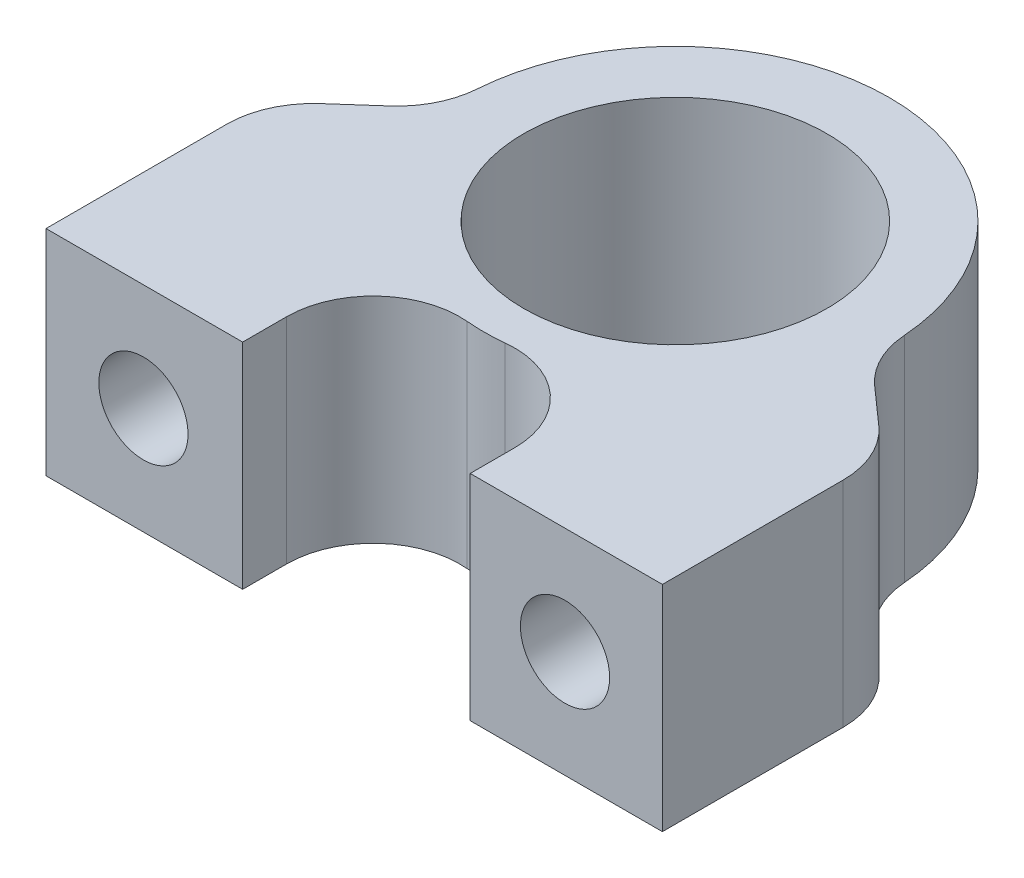
ISO-10303-21;
HEADER;
FILE_DESCRIPTION(('STEP AP214'),'2;1');
FILE_NAME('part.step','',(''),(''),'','','');
FILE_SCHEMA(('AUTOMOTIVE_DESIGN { 1 0 10303 214 1 1 1 1 }'));
ENDSEC;
DATA;
#1=APPLICATION_CONTEXT('core data for automotive mechanical design processes');
#2=APPLICATION_PROTOCOL_DEFINITION('international standard','automotive_design',2000,#1);
#3=PRODUCT_CONTEXT('',#1,'mechanical');
#4=PRODUCT('Part','Part','',(#3));
#5=PRODUCT_RELATED_PRODUCT_CATEGORY('part','',(#4));
#6=PRODUCT_DEFINITION_FORMATION('','',#4);
#7=PRODUCT_DEFINITION_CONTEXT('part definition',#1,'design');
#8=PRODUCT_DEFINITION('design','',#6,#7);
#9=PRODUCT_DEFINITION_SHAPE('','',#8);
#10=(LENGTH_UNIT() NAMED_UNIT(*) SI_UNIT(.MILLI.,.METRE.));
#11=(NAMED_UNIT(*) PLANE_ANGLE_UNIT() SI_UNIT($,.RADIAN.));
#12=(NAMED_UNIT(*) SI_UNIT($,.STERADIAN.) SOLID_ANGLE_UNIT());
#13=UNCERTAINTY_MEASURE_WITH_UNIT(LENGTH_MEASURE(1.E-05),#10,'distance_accuracy_value','');
#14=(GEOMETRIC_REPRESENTATION_CONTEXT(3) GLOBAL_UNCERTAINTY_ASSIGNED_CONTEXT((#13)) GLOBAL_UNIT_ASSIGNED_CONTEXT((#10,
#11,#12)) REPRESENTATION_CONTEXT('',''));
#15=CARTESIAN_POINT('',(0.,0.,0.));
#16=DIRECTION('',(0.,0.,1.));
#17=DIRECTION('',(1.,0.,0.));
#18=AXIS2_PLACEMENT_3D('',#15,#16,#17);
#19=CARTESIAN_POINT('',(17.2701320193385,12.,17.9935));
#20=DIRECTION('',(0.,0.,-1.));
#21=DIRECTION('',(-1.,0.,0.));
#22=AXIS2_PLACEMENT_3D('',#19,#20,#21);
#23=PLANE('',#22);
#24=CARTESIAN_POINT('',(-11.8114211671673,6.,17.9935));
#25=DIRECTION('',(0.,0.,1.));
#26=DIRECTION('',(1.,0.,0.));
#27=AXIS2_PLACEMENT_3D('',#24,#25,#26);
#28=CIRCLE('',#27,2.5);
#29=CARTESIAN_POINT('',(-9.31142116716727,6.,17.9935));
#30=VERTEX_POINT('',#29);
#31=EDGE_CURVE('E320',#30,#30,#28,.T.);
#32=ORIENTED_EDGE('',*,*,#31,.F.);
#33=EDGE_LOOP('',(#32));
#34=FACE_BOUND('',#33,.T.);
#35=DIRECTION('',(1.,0.,0.));
#36=VECTOR('',#35,1.);
#37=CARTESIAN_POINT('',(17.2701320193385,0.,17.9935));
#38=LINE('',#37,#36);
#39=CARTESIAN_POINT('',(-17.2701320193385,0.,17.9935));
#40=VERTEX_POINT('',#39);
#41=CARTESIAN_POINT('',(-6.25,0.,17.9935));
#42=VERTEX_POINT('',#41);
#43=EDGE_CURVE('E204',#40,#42,#38,.T.);
#44=ORIENTED_EDGE('',*,*,#43,.T.);
#45=DIRECTION('',(0.,1.,0.));
#46=VECTOR('',#45,1.);
#47=CARTESIAN_POINT('',(-6.25000000000001,12.,17.9935));
#48=LINE('',#47,#46);
#49=CARTESIAN_POINT('',(-6.25,12.,17.9935));
#50=VERTEX_POINT('',#49);
#51=EDGE_CURVE('E166',#42,#50,#48,.T.);
#52=ORIENTED_EDGE('',*,*,#51,.T.);
#53=DIRECTION('',(1.,0.,0.));
#54=VECTOR('',#53,1.);
#55=CARTESIAN_POINT('',(-17.2701320193385,12.,17.9935));
#56=LINE('',#55,#54);
#57=CARTESIAN_POINT('',(-17.2701320193385,12.,17.9935));
#58=VERTEX_POINT('',#57);
#59=EDGE_CURVE('E183',#58,#50,#56,.T.);
#60=ORIENTED_EDGE('',*,*,#59,.F.);
#61=DIRECTION('',(0.,-1.,0.));
#62=VECTOR('',#61,1.);
#63=CARTESIAN_POINT('',(-17.2701320193385,12.,17.9935));
#64=LINE('',#63,#62);
#65=EDGE_CURVE('E167',#58,#40,#64,.T.);
#66=ORIENTED_EDGE('',*,*,#65,.T.);
#67=EDGE_LOOP('',(#44,#52,#60,#66));
#68=FACE_BOUND('',#67,.T.);
#69=ADVANCED_FACE('F43',(#34,#68),#23,.F.);
#70=CARTESIAN_POINT('',(0.,12.,0.));
#71=DIRECTION('',(0.,1.,0.));
#72=DIRECTION('',(0.,0.,1.));
#73=AXIS2_PLACEMENT_3D('',#70,#71,#72);
#74=PLANE('',#73);
#75=DIRECTION('',(-0.747801655352318,0.,0.663922197439078));
#76=VECTOR('',#75,1.);
#77=CARTESIAN_POINT('',(-11.9935,12.,1.));
#78=LINE('',#77,#76);
#79=CARTESIAN_POINT('',(-13.5793158691782,12.,2.40793798604591));
#80=VERTEX_POINT('',#79);
#81=CARTESIAN_POINT('',(-15.640154676918,12.,4.23761651110581));
#82=VERTEX_POINT('',#81);
#83=EDGE_CURVE('E188',#80,#82,#78,.T.);
#84=ORIENTED_EDGE('',*,*,#83,.T.);
#85=CARTESIAN_POINT('',(-12.4201320193385,12.,7.86445453956455));
#86=DIRECTION('',(0.,1.,0.));
#87=DIRECTION('',(0.,0.,1.));
#88=AXIS2_PLACEMENT_3D('',#85,#86,#87);
#89=CIRCLE('',#88,4.85);
#90=CARTESIAN_POINT('',(-17.2701320193385,12.,7.86445453956455));
#91=VERTEX_POINT('',#90);
#92=EDGE_CURVE('E247',#82,#91,#89,.T.);
#93=ORIENTED_EDGE('',*,*,#92,.T.);
#94=DIRECTION('',(0.,0.,1.));
#95=VECTOR('',#94,1.);
#96=CARTESIAN_POINT('',(-17.2701320193385,12.,5.68476246379276));
#97=LINE('',#96,#95);
#98=EDGE_CURVE('E184',#91,#58,#97,.T.);
#99=ORIENTED_EDGE('',*,*,#98,.T.);
#100=ORIENTED_EDGE('',*,*,#59,.T.);
#101=DIRECTION('',(0.,0.,1.));
#102=VECTOR('',#101,1.);
#103=CARTESIAN_POINT('',(-6.25,12.,17.9935));
#104=LINE('',#103,#102);
#105=CARTESIAN_POINT('',(-6.25,12.,15.5305261420855));
#106=VERTEX_POINT('',#105);
#107=EDGE_CURVE('E327',#106,#50,#104,.T.);
#108=ORIENTED_EDGE('',*,*,#107,.F.);
#109=CARTESIAN_POINT('',(-1.4,12.,15.5305261420855));
#110=DIRECTION('',(0.,1.,0.));
#111=DIRECTION('',(0.,0.,1.));
#112=AXIS2_PLACEMENT_3D('',#109,#110,#111);
#113=CIRCLE('',#112,4.85);
#114=CARTESIAN_POINT('',(-0.964562157309138,12.,10.7001127141113));
#115=VERTEX_POINT('',#114);
#116=EDGE_CURVE('E264',#106,#115,#113,.F.);
#117=ORIENTED_EDGE('',*,*,#116,.T.);
#118=CARTESIAN_POINT('',(0.,12.,0.));
#119=DIRECTION('',(0.,-1.,0.));
#120=DIRECTION('',(0.,0.,1.));
#121=AXIS2_PLACEMENT_3D('',#118,#119,#120);
#122=CIRCLE('',#121,10.7435);
#123=CARTESIAN_POINT('',(1.13680539968576,12.,10.6831861227466));
#124=VERTEX_POINT('',#123);
#125=EDGE_CURVE('E177',#124,#115,#122,.T.);
#126=ORIENTED_EDGE('',*,*,#125,.F.);
#127=CARTESIAN_POINT('',(1.65,12.,15.5059582822217));
#128=DIRECTION('',(0.,1.,0.));
#129=DIRECTION('',(0.,0.,1.));
#130=AXIS2_PLACEMENT_3D('',#127,#128,#129);
#131=CIRCLE('',#130,4.85);
#132=CARTESIAN_POINT('',(6.5,12.,15.5059582822217));
#133=VERTEX_POINT('',#132);
#134=EDGE_CURVE('E176',#124,#133,#131,.F.);
#135=ORIENTED_EDGE('',*,*,#134,.T.);
#136=DIRECTION('',(0.,0.,-1.));
#137=VECTOR('',#136,1.);
#138=CARTESIAN_POINT('',(6.5,12.,17.9935));
#139=LINE('',#138,#137);
#140=CARTESIAN_POINT('',(6.5,12.,17.9935));
#141=VERTEX_POINT('',#140);
#142=EDGE_CURVE('E159',#141,#133,#139,.T.);
#143=ORIENTED_EDGE('',*,*,#142,.F.);
#144=CARTESIAN_POINT('',(17.2701320193385,12.,17.9935));
#145=VERTEX_POINT('',#144);
#146=EDGE_CURVE('E173',#141,#145,#56,.T.);
#147=ORIENTED_EDGE('',*,*,#146,.T.);
#148=DIRECTION('',(0.,0.,-1.));
#149=VECTOR('',#148,1.);
#150=CARTESIAN_POINT('',(17.2701320193385,12.,5.68476246379276));
#151=LINE('',#150,#149);
#152=CARTESIAN_POINT('',(17.2701320193385,12.,7.86445453956455));
#153=VERTEX_POINT('',#152);
#154=EDGE_CURVE('E187',#145,#153,#151,.T.);
#155=ORIENTED_EDGE('',*,*,#154,.T.);
#156=CARTESIAN_POINT('',(12.4201320193385,12.,7.86445453956455));
#157=DIRECTION('',(0.,1.,0.));
#158=DIRECTION('',(0.,0.,1.));
#159=AXIS2_PLACEMENT_3D('',#156,#157,#158);
#160=CIRCLE('',#159,4.85);
#161=CARTESIAN_POINT('',(15.640154676918,12.,4.23761651110581));
#162=VERTEX_POINT('',#161);
#163=EDGE_CURVE('E245',#153,#162,#160,.T.);
#164=ORIENTED_EDGE('',*,*,#163,.T.);
#165=DIRECTION('',(-0.747801655352318,0.,-0.663922197439078));
#166=VECTOR('',#165,1.);
#167=CARTESIAN_POINT('',(11.9935,12.,1.));
#168=LINE('',#167,#166);
#169=CARTESIAN_POINT('',(13.5793158691782,12.,2.40793798604591));
#170=VERTEX_POINT('',#169);
#171=EDGE_CURVE('E193',#162,#170,#168,.T.);
#172=ORIENTED_EDGE('',*,*,#171,.T.);
#173=CARTESIAN_POINT('',(16.7993385267577,12.,-1.21890004241283));
#174=DIRECTION('',(0.,1.,0.));
#175=DIRECTION('',(0.,0.,1.));
#176=AXIS2_PLACEMENT_3D('',#173,#174,#175);
#177=CIRCLE('',#176,4.85);
#178=CARTESIAN_POINT('',(11.9620545979558,12.,-0.867923986028929));
#179=VERTEX_POINT('',#178);
#180=EDGE_CURVE('E11',#170,#179,#177,.F.);
#181=ORIENTED_EDGE('',*,*,#180,.T.);
#182=CARTESIAN_POINT('',(0.,12.,0.));
#183=DIRECTION('',(0.,1.,0.));
#184=DIRECTION('',(0.,0.,1.));
#185=AXIS2_PLACEMENT_3D('',#182,#183,#184);
#186=CIRCLE('',#185,11.9935);
#187=CARTESIAN_POINT('',(-11.9620545979558,12.,-0.867923986028929));
#188=VERTEX_POINT('',#187);
#189=EDGE_CURVE('E195',#179,#188,#186,.T.);
#190=ORIENTED_EDGE('',*,*,#189,.T.);
#191=CARTESIAN_POINT('',(-16.7993385267577,12.,-1.21890004241283));
#192=DIRECTION('',(0.,1.,0.));
#193=DIRECTION('',(0.,0.,1.));
#194=AXIS2_PLACEMENT_3D('',#191,#192,#193);
#195=CIRCLE('',#194,4.85);
#196=EDGE_CURVE('E270',#188,#80,#195,.F.);
#197=ORIENTED_EDGE('',*,*,#196,.T.);
#198=EDGE_LOOP('',(#84,#93,#99,#100,#108,#117,#126,#135,#143,#147,#155,#164,#172,#181,#190,#197));
#199=FACE_BOUND('',#198,.T.);
#200=CARTESIAN_POINT('',(0.,12.,0.));
#201=DIRECTION('',(0.,1.,0.));
#202=DIRECTION('',(0.,0.,1.));
#203=AXIS2_PLACEMENT_3D('',#200,#201,#202);
#204=CIRCLE('',#203,8.4935);
#205=CARTESIAN_POINT('',(0.,12.,8.4935));
#206=VERTEX_POINT('',#205);
#207=EDGE_CURVE('E201',#206,#206,#204,.T.);
#208=ORIENTED_EDGE('',*,*,#207,.F.);
#209=EDGE_LOOP('',(#208));
#210=FACE_BOUND('',#209,.T.);
#211=ADVANCED_FACE('F170',(#199,#210),#74,.T.);
#212=CARTESIAN_POINT('',(0.,0.,0.));
#213=DIRECTION('',(0.,1.,0.));
#214=DIRECTION('',(0.,0.,1.));
#215=AXIS2_PLACEMENT_3D('',#212,#213,#214);
#216=PLANE('',#215);
#217=DIRECTION('',(0.,0.,1.));
#218=VECTOR('',#217,1.);
#219=CARTESIAN_POINT('',(-17.2701320193385,0.,5.68476246379276));
#220=LINE('',#219,#218);
#221=CARTESIAN_POINT('',(-17.2701320193385,0.,7.86445453956455));
#222=VERTEX_POINT('',#221);
#223=EDGE_CURVE('E200',#222,#40,#220,.T.);
#224=ORIENTED_EDGE('',*,*,#223,.F.);
#225=CARTESIAN_POINT('',(-12.4201320193385,0.,7.86445453956455));
#226=DIRECTION('',(0.,1.,0.));
#227=DIRECTION('',(0.,0.,1.));
#228=AXIS2_PLACEMENT_3D('',#225,#226,#227);
#229=CIRCLE('',#228,4.85);
#230=CARTESIAN_POINT('',(-15.640154676918,0.,4.23761651110581));
#231=VERTEX_POINT('',#230);
#232=EDGE_CURVE('E238',#222,#231,#229,.F.);
#233=ORIENTED_EDGE('',*,*,#232,.T.);
#234=DIRECTION('',(-0.747801655352318,0.,0.663922197439078));
#235=VECTOR('',#234,1.);
#236=CARTESIAN_POINT('',(-11.9935,0.,1.));
#237=LINE('',#236,#235);
#238=CARTESIAN_POINT('',(-13.5793158691782,0.,2.40793798604591));
#239=VERTEX_POINT('',#238);
#240=EDGE_CURVE('E197',#239,#231,#237,.T.);
#241=ORIENTED_EDGE('',*,*,#240,.F.);
#242=CARTESIAN_POINT('',(-16.7993385267577,0.,-1.21890004241283));
#243=DIRECTION('',(0.,1.,0.));
#244=DIRECTION('',(0.,0.,1.));
#245=AXIS2_PLACEMENT_3D('',#242,#243,#244);
#246=CIRCLE('',#245,4.85);
#247=CARTESIAN_POINT('',(-11.9620545979558,0.,-0.867923986028929));
#248=VERTEX_POINT('',#247);
#249=EDGE_CURVE('E268',#239,#248,#246,.T.);
#250=ORIENTED_EDGE('',*,*,#249,.T.);
#251=CARTESIAN_POINT('',(0.,0.,0.));
#252=DIRECTION('',(0.,1.,0.));
#253=DIRECTION('',(0.,0.,1.));
#254=AXIS2_PLACEMENT_3D('',#251,#252,#253);
#255=CIRCLE('',#254,11.9935);
#256=CARTESIAN_POINT('',(11.9620545979558,0.,-0.867923986028929));
#257=VERTEX_POINT('',#256);
#258=EDGE_CURVE('E213',#257,#248,#255,.T.);
#259=ORIENTED_EDGE('',*,*,#258,.F.);
#260=CARTESIAN_POINT('',(16.7993385267577,0.,-1.21890004241283));
#261=DIRECTION('',(0.,1.,0.));
#262=DIRECTION('',(0.,0.,1.));
#263=AXIS2_PLACEMENT_3D('',#260,#261,#262);
#264=CIRCLE('',#263,4.85);
#265=CARTESIAN_POINT('',(13.5793158691782,0.,2.40793798604591));
#266=VERTEX_POINT('',#265);
#267=EDGE_CURVE('E51',#257,#266,#264,.T.);
#268=ORIENTED_EDGE('',*,*,#267,.T.);
#269=DIRECTION('',(-0.747801655352318,0.,-0.663922197439078));
#270=VECTOR('',#269,1.);
#271=CARTESIAN_POINT('',(11.9935,0.,1.));
#272=LINE('',#271,#270);
#273=CARTESIAN_POINT('',(15.640154676918,0.,4.23761651110581));
#274=VERTEX_POINT('',#273);
#275=EDGE_CURVE('E210',#274,#266,#272,.T.);
#276=ORIENTED_EDGE('',*,*,#275,.F.);
#277=CARTESIAN_POINT('',(12.4201320193385,0.,7.86445453956455));
#278=DIRECTION('',(0.,1.,0.));
#279=DIRECTION('',(0.,0.,1.));
#280=AXIS2_PLACEMENT_3D('',#277,#278,#279);
#281=CIRCLE('',#280,4.85);
#282=CARTESIAN_POINT('',(17.2701320193385,0.,7.86445453956455));
#283=VERTEX_POINT('',#282);
#284=EDGE_CURVE('E236',#274,#283,#281,.F.);
#285=ORIENTED_EDGE('',*,*,#284,.T.);
#286=DIRECTION('',(0.,0.,-1.));
#287=VECTOR('',#286,1.);
#288=CARTESIAN_POINT('',(17.2701320193385,0.,5.68476246379276));
#289=LINE('',#288,#287);
#290=CARTESIAN_POINT('',(17.2701320193385,0.,17.9935));
#291=VERTEX_POINT('',#290);
#292=EDGE_CURVE('E207',#291,#283,#289,.T.);
#293=ORIENTED_EDGE('',*,*,#292,.F.);
#294=CARTESIAN_POINT('',(6.5,0.,17.9935));
#295=VERTEX_POINT('',#294);
#296=EDGE_CURVE('E203',#295,#291,#38,.T.);
#297=ORIENTED_EDGE('',*,*,#296,.F.);
#298=DIRECTION('',(0.,0.,-1.));
#299=VECTOR('',#298,1.);
#300=CARTESIAN_POINT('',(6.5,0.,0.));
#301=LINE('',#300,#299);
#302=CARTESIAN_POINT('',(6.5,0.,15.5059582822217));
#303=VERTEX_POINT('',#302);
#304=EDGE_CURVE('E162',#295,#303,#301,.T.);
#305=ORIENTED_EDGE('',*,*,#304,.T.);
#306=CARTESIAN_POINT('',(1.65,0.,15.5059582822217));
#307=DIRECTION('',(0.,1.,0.));
#308=DIRECTION('',(0.,0.,1.));
#309=AXIS2_PLACEMENT_3D('',#306,#307,#308);
#310=CIRCLE('',#309,4.85);
#311=CARTESIAN_POINT('',(1.13680539968576,0.,10.6831861227466));
#312=VERTEX_POINT('',#311);
#313=EDGE_CURVE('E262',#303,#312,#310,.T.);
#314=ORIENTED_EDGE('',*,*,#313,.T.);
#315=CARTESIAN_POINT('',(0.,0.,0.));
#316=DIRECTION('',(0.,1.,0.));
#317=DIRECTION('',(0.,0.,1.));
#318=AXIS2_PLACEMENT_3D('',#315,#316,#317);
#319=CIRCLE('',#318,10.7435);
#320=CARTESIAN_POINT('',(-0.964562157309138,0.,10.7001127141113));
#321=VERTEX_POINT('',#320);
#322=EDGE_CURVE('E220',#312,#321,#319,.F.);
#323=ORIENTED_EDGE('',*,*,#322,.T.);
#324=CARTESIAN_POINT('',(-1.4,0.,15.5305261420855));
#325=DIRECTION('',(0.,1.,0.));
#326=DIRECTION('',(0.,0.,1.));
#327=AXIS2_PLACEMENT_3D('',#324,#325,#326);
#328=CIRCLE('',#327,4.85);
#329=CARTESIAN_POINT('',(-6.25,0.,15.5305261420855));
#330=VERTEX_POINT('',#329);
#331=EDGE_CURVE('E266',#321,#330,#328,.T.);
#332=ORIENTED_EDGE('',*,*,#331,.T.);
#333=DIRECTION('',(0.,0.,1.));
#334=VECTOR('',#333,1.);
#335=CARTESIAN_POINT('',(-6.25,0.,0.));
#336=LINE('',#335,#334);
#337=EDGE_CURVE('E317',#330,#42,#336,.T.);
#338=ORIENTED_EDGE('',*,*,#337,.T.);
#339=ORIENTED_EDGE('',*,*,#43,.F.);
#340=EDGE_LOOP('',(#224,#233,#241,#250,#259,#268,#276,#285,#293,#297,#305,#314,#323,#332,#338,#339));
#341=FACE_BOUND('',#340,.T.);
#342=CARTESIAN_POINT('',(0.,0.,0.));
#343=DIRECTION('',(0.,1.,0.));
#344=DIRECTION('',(0.,0.,1.));
#345=AXIS2_PLACEMENT_3D('',#342,#343,#344);
#346=CIRCLE('',#345,8.4935);
#347=CARTESIAN_POINT('',(0.,0.,8.4935));
#348=VERTEX_POINT('',#347);
#349=EDGE_CURVE('E307',#348,#348,#346,.T.);
#350=ORIENTED_EDGE('',*,*,#349,.T.);
#351=EDGE_LOOP('',(#350));
#352=FACE_BOUND('',#351,.T.);
#353=ADVANCED_FACE('F275',(#341,#352),#216,.F.);
#354=CARTESIAN_POINT('',(-11.9935,12.,1.));
#355=DIRECTION('',(0.663922197439078,0.,0.747801655352317));
#356=DIRECTION('',(0.747801655352318,0.,-0.663922197439078));
#357=AXIS2_PLACEMENT_3D('',#354,#355,#356);
#358=PLANE('',#357);
#359=ORIENTED_EDGE('',*,*,#240,.T.);
#360=DIRECTION('',(0.,-1.,0.));
#361=VECTOR('',#360,1.);
#362=CARTESIAN_POINT('',(-15.640154676918,12.,4.23761651110581));
#363=LINE('',#362,#361);
#364=EDGE_CURVE('E243',#231,#82,#363,.F.);
#365=ORIENTED_EDGE('',*,*,#364,.T.);
#366=ORIENTED_EDGE('',*,*,#83,.F.);
#367=DIRECTION('',(0.,1.,0.));
#368=VECTOR('',#367,1.);
#369=CARTESIAN_POINT('',(-13.5793158691782,0.,2.40793798604591));
#370=LINE('',#369,#368);
#371=EDGE_CURVE('E240',#80,#239,#370,.F.);
#372=ORIENTED_EDGE('',*,*,#371,.T.);
#373=EDGE_LOOP('',(#359,#365,#366,#372));
#374=FACE_BOUND('',#373,.T.);
#375=ADVANCED_FACE('F293',(#374),#358,.F.);
#376=CARTESIAN_POINT('',(-17.2701320193385,12.,5.68476246379276));
#377=DIRECTION('',(1.,0.,0.));
#378=DIRECTION('',(0.,0.,-1.));
#379=AXIS2_PLACEMENT_3D('',#376,#377,#378);
#380=PLANE('',#379);
#381=ORIENTED_EDGE('',*,*,#98,.F.);
#382=DIRECTION('',(0.,-1.,0.));
#383=VECTOR('',#382,1.);
#384=CARTESIAN_POINT('',(-17.2701320193385,12.,7.86445453956455));
#385=LINE('',#384,#383);
#386=EDGE_CURVE('E233',#91,#222,#385,.T.);
#387=ORIENTED_EDGE('',*,*,#386,.T.);
#388=ORIENTED_EDGE('',*,*,#223,.T.);
#389=ORIENTED_EDGE('',*,*,#65,.F.);
#390=EDGE_LOOP('',(#381,#387,#388,#389));
#391=FACE_BOUND('',#390,.T.);
#392=ADVANCED_FACE('F302',(#391),#380,.F.);
#393=CARTESIAN_POINT('',(11.8114211671673,6.,17.9935));
#394=DIRECTION('',(0.,0.,1.));
#395=DIRECTION('',(1.,0.,0.));
#396=AXIS2_PLACEMENT_3D('',#393,#394,#395);
#397=CIRCLE('',#396,2.5);
#398=CARTESIAN_POINT('',(14.3114211671673,6.,17.9935));
#399=VERTEX_POINT('',#398);
#400=EDGE_CURVE('E313',#399,#399,#397,.T.);
#401=ORIENTED_EDGE('',*,*,#400,.F.);
#402=EDGE_LOOP('',(#401));
#403=FACE_BOUND('',#402,.T.);
#404=ORIENTED_EDGE('',*,*,#146,.F.);
#405=DIRECTION('',(0.,-1.,0.));
#406=VECTOR('',#405,1.);
#407=CARTESIAN_POINT('',(6.5,12.,17.9935));
#408=LINE('',#407,#406);
#409=EDGE_CURVE('E156',#141,#295,#408,.T.);
#410=ORIENTED_EDGE('',*,*,#409,.T.);
#411=ORIENTED_EDGE('',*,*,#296,.T.);
#412=DIRECTION('',(0.,-1.,0.));
#413=VECTOR('',#412,1.);
#414=CARTESIAN_POINT('',(17.2701320193385,12.,17.9935));
#415=LINE('',#414,#413);
#416=EDGE_CURVE('E181',#145,#291,#415,.T.);
#417=ORIENTED_EDGE('',*,*,#416,.F.);
#418=EDGE_LOOP('',(#404,#410,#411,#417));
#419=FACE_BOUND('',#418,.T.);
#420=ADVANCED_FACE('F179',(#403,#419),#23,.F.);
#421=CARTESIAN_POINT('',(17.2701320193385,12.,5.68476246379276));
#422=DIRECTION('',(-1.,0.,0.));
#423=DIRECTION('',(0.,0.,1.));
#424=AXIS2_PLACEMENT_3D('',#421,#422,#423);
#425=PLANE('',#424);
#426=ORIENTED_EDGE('',*,*,#292,.T.);
#427=DIRECTION('',(0.,-1.,0.));
#428=VECTOR('',#427,1.);
#429=CARTESIAN_POINT('',(17.2701320193385,12.,7.86445453956455));
#430=LINE('',#429,#428);
#431=EDGE_CURVE('E259',#283,#153,#430,.F.);
#432=ORIENTED_EDGE('',*,*,#431,.T.);
#433=ORIENTED_EDGE('',*,*,#154,.F.);
#434=ORIENTED_EDGE('',*,*,#416,.T.);
#435=EDGE_LOOP('',(#426,#432,#433,#434));
#436=FACE_BOUND('',#435,.T.);
#437=ADVANCED_FACE('F355',(#436),#425,.F.);
#438=CARTESIAN_POINT('',(11.9935,12.,1.));
#439=DIRECTION('',(-0.663922197439078,0.,0.747801655352317));
#440=DIRECTION('',(0.747801655352318,0.,0.663922197439078));
#441=AXIS2_PLACEMENT_3D('',#438,#439,#440);
#442=PLANE('',#441);
#443=ORIENTED_EDGE('',*,*,#275,.T.);
#444=DIRECTION('',(0.,1.,0.));
#445=VECTOR('',#444,1.);
#446=CARTESIAN_POINT('',(13.5793158691782,12.,2.40793798604591));
#447=LINE('',#446,#445);
#448=EDGE_CURVE('E257',#266,#170,#447,.T.);
#449=ORIENTED_EDGE('',*,*,#448,.T.);
#450=ORIENTED_EDGE('',*,*,#171,.F.);
#451=DIRECTION('',(0.,-1.,0.));
#452=VECTOR('',#451,1.);
#453=CARTESIAN_POINT('',(15.640154676918,12.,4.23761651110581));
#454=LINE('',#453,#452);
#455=EDGE_CURVE('E254',#162,#274,#454,.T.);
#456=ORIENTED_EDGE('',*,*,#455,.T.);
#457=EDGE_LOOP('',(#443,#449,#450,#456));
#458=FACE_BOUND('',#457,.T.);
#459=ADVANCED_FACE('F281',(#458),#442,.F.);
#460=CARTESIAN_POINT('',(0.,12.,0.));
#461=DIRECTION('',(0.,-1.,0.));
#462=DIRECTION('',(0.,0.,-1.));
#463=AXIS2_PLACEMENT_3D('',#460,#461,#462);
#464=CYLINDRICAL_SURFACE('',#463,11.9935);
#465=ORIENTED_EDGE('',*,*,#258,.T.);
#466=DIRECTION('',(0.,-1.,0.));
#467=VECTOR('',#466,1.);
#468=CARTESIAN_POINT('',(-11.9620545979558,12.,-0.867923986028929));
#469=LINE('',#468,#467);
#470=EDGE_CURVE('E58',#248,#188,#469,.F.);
#471=ORIENTED_EDGE('',*,*,#470,.T.);
#472=ORIENTED_EDGE('',*,*,#189,.F.);
#473=DIRECTION('',(0.,-1.,0.));
#474=VECTOR('',#473,1.);
#475=CARTESIAN_POINT('',(11.9620545979558,12.,-0.867923986028929));
#476=LINE('',#475,#474);
#477=EDGE_CURVE('E249',#179,#257,#476,.T.);
#478=ORIENTED_EDGE('',*,*,#477,.T.);
#479=EDGE_LOOP('',(#465,#471,#472,#478));
#480=FACE_BOUND('',#479,.T.);
#481=ADVANCED_FACE('F285',(#480),#464,.T.);
#482=CARTESIAN_POINT('',(0.,12.,0.));
#483=DIRECTION('',(0.,-1.,0.));
#484=DIRECTION('',(0.,0.,-1.));
#485=AXIS2_PLACEMENT_3D('',#482,#483,#484);
#486=CYLINDRICAL_SURFACE('',#485,8.4935);
#487=ORIENTED_EDGE('',*,*,#207,.T.);
#488=EDGE_LOOP('',(#487));
#489=FACE_BOUND('',#488,.T.);
#490=ORIENTED_EDGE('',*,*,#349,.F.);
#491=EDGE_LOOP('',(#490));
#492=FACE_BOUND('',#491,.T.);
#493=ADVANCED_FACE('F367',(#489,#492),#486,.F.);
#494=CARTESIAN_POINT('',(11.8114211671673,6.,7.4935));
#495=DIRECTION('',(0.,0.,1.));
#496=DIRECTION('',(1.,0.,0.));
#497=AXIS2_PLACEMENT_3D('',#494,#495,#496);
#498=CYLINDRICAL_SURFACE('',#497,2.5);
#499=CARTESIAN_POINT('',(11.8114211671673,6.,7.4935));
#500=DIRECTION('',(0.,0.,1.));
#501=DIRECTION('',(1.,0.,0.));
#502=AXIS2_PLACEMENT_3D('',#499,#500,#501);
#503=CIRCLE('',#502,2.5);
#504=CARTESIAN_POINT('',(14.3114211671673,6.,7.4935));
#505=VERTEX_POINT('',#504);
#506=EDGE_CURVE('E316',#505,#505,#503,.T.);
#507=CARTESIAN_POINT('',(14.3114211671673,6.,7.4935));
#508=CARTESIAN_POINT('',(14.3114211671673,6.,7.602875));
#509=CARTESIAN_POINT('',(14.3114211671673,6.,7.71225));
#510=CARTESIAN_POINT('',(14.3114211671673,6.,7.931));
#511=CARTESIAN_POINT('',(14.3114211671673,6.,8.040375));
#512=CARTESIAN_POINT('',(14.3114211671673,6.,8.259125));
#513=CARTESIAN_POINT('',(14.3114211671673,6.,8.3685));
#514=CARTESIAN_POINT('',(14.3114211671673,6.,8.58725));
#515=CARTESIAN_POINT('',(14.3114211671673,6.,8.696625));
#516=CARTESIAN_POINT('',(14.3114211671673,6.,8.915375));
#517=CARTESIAN_POINT('',(14.3114211671673,6.,9.02475));
#518=CARTESIAN_POINT('',(14.3114211671673,6.,9.2435));
#519=CARTESIAN_POINT('',(14.3114211671673,6.,9.352875));
#520=CARTESIAN_POINT('',(14.3114211671673,6.,9.571625));
#521=CARTESIAN_POINT('',(14.3114211671673,6.,9.681));
#522=CARTESIAN_POINT('',(14.3114211671673,6.,9.89975));
#523=CARTESIAN_POINT('',(14.3114211671673,6.,10.009125));
#524=CARTESIAN_POINT('',(14.3114211671673,6.,10.227875));
#525=CARTESIAN_POINT('',(14.3114211671673,6.,10.33725));
#526=CARTESIAN_POINT('',(14.3114211671673,6.,10.556));
#527=CARTESIAN_POINT('',(14.3114211671673,6.,10.665375));
#528=CARTESIAN_POINT('',(14.3114211671673,6.,10.884125));
#529=CARTESIAN_POINT('',(14.3114211671673,6.,10.9935));
#530=CARTESIAN_POINT('',(14.3114211671673,6.,11.21225));
#531=CARTESIAN_POINT('',(14.3114211671673,6.,11.321625));
#532=CARTESIAN_POINT('',(14.3114211671673,6.,11.540375));
#533=CARTESIAN_POINT('',(14.3114211671673,6.,11.64975));
#534=CARTESIAN_POINT('',(14.3114211671673,6.,11.8685));
#535=CARTESIAN_POINT('',(14.3114211671673,6.,11.977875));
#536=CARTESIAN_POINT('',(14.3114211671673,6.,12.196625));
#537=CARTESIAN_POINT('',(14.3114211671673,6.,12.306));
#538=CARTESIAN_POINT('',(14.3114211671673,6.,12.52475));
#539=CARTESIAN_POINT('',(14.3114211671673,6.,12.634125));
#540=CARTESIAN_POINT('',(14.3114211671673,6.,12.852875));
#541=CARTESIAN_POINT('',(14.3114211671673,6.,12.96225));
#542=CARTESIAN_POINT('',(14.3114211671673,6.,13.181));
#543=CARTESIAN_POINT('',(14.3114211671673,6.,13.290375));
#544=CARTESIAN_POINT('',(14.3114211671673,6.,13.509125));
#545=CARTESIAN_POINT('',(14.3114211671673,6.,13.6185));
#546=CARTESIAN_POINT('',(14.3114211671673,6.,13.83725));
#547=CARTESIAN_POINT('',(14.3114211671673,6.,13.946625));
#548=CARTESIAN_POINT('',(14.3114211671673,6.,14.165375));
#549=CARTESIAN_POINT('',(14.3114211671673,6.,14.27475));
#550=CARTESIAN_POINT('',(14.3114211671673,6.,14.4935));
#551=CARTESIAN_POINT('',(14.3114211671673,6.,14.602875));
#552=CARTESIAN_POINT('',(14.3114211671673,6.,14.821625));
#553=CARTESIAN_POINT('',(14.3114211671673,6.,14.931));
#554=CARTESIAN_POINT('',(14.3114211671673,6.,15.14975));
#555=CARTESIAN_POINT('',(14.3114211671673,6.,15.259125));
#556=CARTESIAN_POINT('',(14.3114211671673,6.,15.477875));
#557=CARTESIAN_POINT('',(14.3114211671673,6.,15.58725));
#558=CARTESIAN_POINT('',(14.3114211671673,6.,15.806));
#559=CARTESIAN_POINT('',(14.3114211671673,6.,15.915375));
#560=CARTESIAN_POINT('',(14.3114211671673,6.,16.134125));
#561=CARTESIAN_POINT('',(14.3114211671673,6.,16.2435));
#562=CARTESIAN_POINT('',(14.3114211671673,6.,16.46225));
#563=CARTESIAN_POINT('',(14.3114211671673,6.,16.571625));
#564=CARTESIAN_POINT('',(14.3114211671673,6.,16.790375));
#565=CARTESIAN_POINT('',(14.3114211671673,6.,16.89975));
#566=CARTESIAN_POINT('',(14.3114211671673,6.,17.1185));
#567=CARTESIAN_POINT('',(14.3114211671673,6.,17.227875));
#568=CARTESIAN_POINT('',(14.3114211671673,6.,17.446625));
#569=CARTESIAN_POINT('',(14.3114211671673,6.,17.556));
#570=CARTESIAN_POINT('',(14.3114211671673,6.,17.77475));
#571=CARTESIAN_POINT('',(14.3114211671673,6.,17.884125));
#572=CARTESIAN_POINT('',(14.3114211671673,6.,17.9935));
#573=B_SPLINE_CURVE_WITH_KNOTS('',3,(#507,#508,#509,#510,#511,#512,#513,#514,#515,#516,#517,
#518,#519,#520,#521,#522,#523,#524,#525,#526,#527,#528,#529,#530,#531,#532,#533,#534,#535,#536,
#537,#538,#539,#540,#541,#542,#543,#544,#545,#546,#547,#548,#549,#550,#551,#552,#553,#554,#555,
#556,#557,#558,#559,#560,#561,#562,#563,#564,#565,#566,#567,#568,#569,#570,#571,#572),
.UNSPECIFIED.,.F.,.F.,(4,2,2,2,2,2,2,2,2,2,2,2,2,2,2,2,2,2,2,2,2,2,2,2,2,2,2,2,2,2,2,2,4),(0.,
0.328125,0.656249999999999,0.984374999999999,1.3125,1.640625,1.96875,2.296875,2.625,2.953125,
3.28125,3.609375,3.9375,4.265625,4.59375,4.921875,5.25,5.578125,5.90625,6.234375,6.5625,
6.890625,7.21875,7.546875,7.875,8.203125,8.53125,8.859375,9.1875,9.515625,9.84375,10.171875,
10.5),.UNSPECIFIED.);
#574=EDGE_CURVE('BSEAM364',#505,#399,#573,.T.);
#575=ORIENTED_EDGE('',*,*,#506,.F.);
#576=ORIENTED_EDGE('',*,*,#400,.T.);
#577=ORIENTED_EDGE('',*,*,#574,.T.);
#578=ORIENTED_EDGE('',*,*,#574,.F.);
#579=EDGE_LOOP('',(#575,#577,#576,#578));
#580=FACE_BOUND('',#579,.T.);
#581=ADVANCED_FACE('F364',(#580),#498,.F.);
#582=CARTESIAN_POINT('',(11.8114211671673,6.,7.4935));
#583=DIRECTION('',(0.,0.,1.));
#584=DIRECTION('',(1.,0.,0.));
#585=AXIS2_PLACEMENT_3D('',#582,#583,#584);
#586=PLANE('',#585);
#587=ORIENTED_EDGE('',*,*,#506,.T.);
#588=EDGE_LOOP('',(#587));
#589=FACE_BOUND('',#588,.T.);
#590=ADVANCED_FACE('F366',(#589),#586,.T.);
#591=CARTESIAN_POINT('',(-11.8114211671673,6.,7.4935));
#592=DIRECTION('',(0.,0.,1.));
#593=DIRECTION('',(1.,0.,0.));
#594=AXIS2_PLACEMENT_3D('',#591,#592,#593);
#595=CYLINDRICAL_SURFACE('',#594,2.5);
#596=CARTESIAN_POINT('',(-11.8114211671673,6.,7.4935));
#597=DIRECTION('',(0.,0.,1.));
#598=DIRECTION('',(1.,0.,0.));
#599=AXIS2_PLACEMENT_3D('',#596,#597,#598);
#600=CIRCLE('',#599,2.5);
#601=CARTESIAN_POINT('',(-9.31142116716727,6.,7.4935));
#602=VERTEX_POINT('',#601);
#603=EDGE_CURVE('E310',#602,#602,#600,.T.);
#604=CARTESIAN_POINT('',(-9.31142116716727,6.,7.4935));
#605=CARTESIAN_POINT('',(-9.31142116716727,6.,7.602875));
#606=CARTESIAN_POINT('',(-9.31142116716727,6.,7.71225));
#607=CARTESIAN_POINT('',(-9.31142116716727,6.,7.931));
#608=CARTESIAN_POINT('',(-9.31142116716727,6.,8.040375));
#609=CARTESIAN_POINT('',(-9.31142116716727,6.,8.259125));
#610=CARTESIAN_POINT('',(-9.31142116716727,6.,8.3685));
#611=CARTESIAN_POINT('',(-9.31142116716727,6.,8.58725));
#612=CARTESIAN_POINT('',(-9.31142116716727,6.,8.696625));
#613=CARTESIAN_POINT('',(-9.31142116716727,6.,8.915375));
#614=CARTESIAN_POINT('',(-9.31142116716727,6.,9.02475));
#615=CARTESIAN_POINT('',(-9.31142116716727,6.,9.2435));
#616=CARTESIAN_POINT('',(-9.31142116716727,6.,9.352875));
#617=CARTESIAN_POINT('',(-9.31142116716727,6.,9.571625));
#618=CARTESIAN_POINT('',(-9.31142116716727,6.,9.681));
#619=CARTESIAN_POINT('',(-9.31142116716727,6.,9.89975));
#620=CARTESIAN_POINT('',(-9.31142116716727,6.,10.009125));
#621=CARTESIAN_POINT('',(-9.31142116716727,6.,10.227875));
#622=CARTESIAN_POINT('',(-9.31142116716727,6.,10.33725));
#623=CARTESIAN_POINT('',(-9.31142116716727,6.,10.556));
#624=CARTESIAN_POINT('',(-9.31142116716727,6.,10.665375));
#625=CARTESIAN_POINT('',(-9.31142116716727,6.,10.884125));
#626=CARTESIAN_POINT('',(-9.31142116716727,6.,10.9935));
#627=CARTESIAN_POINT('',(-9.31142116716727,6.,11.21225));
#628=CARTESIAN_POINT('',(-9.31142116716727,6.,11.321625));
#629=CARTESIAN_POINT('',(-9.31142116716727,6.,11.540375));
#630=CARTESIAN_POINT('',(-9.31142116716727,6.,11.64975));
#631=CARTESIAN_POINT('',(-9.31142116716727,6.,11.8685));
#632=CARTESIAN_POINT('',(-9.31142116716727,6.,11.977875));
#633=CARTESIAN_POINT('',(-9.31142116716727,6.,12.196625));
#634=CARTESIAN_POINT('',(-9.31142116716727,6.,12.306));
#635=CARTESIAN_POINT('',(-9.31142116716727,6.,12.52475));
#636=CARTESIAN_POINT('',(-9.31142116716727,6.,12.634125));
#637=CARTESIAN_POINT('',(-9.31142116716727,6.,12.852875));
#638=CARTESIAN_POINT('',(-9.31142116716727,6.,12.96225));
#639=CARTESIAN_POINT('',(-9.31142116716727,6.,13.181));
#640=CARTESIAN_POINT('',(-9.31142116716727,6.,13.290375));
#641=CARTESIAN_POINT('',(-9.31142116716727,6.,13.509125));
#642=CARTESIAN_POINT('',(-9.31142116716727,6.,13.6185));
#643=CARTESIAN_POINT('',(-9.31142116716727,6.,13.83725));
#644=CARTESIAN_POINT('',(-9.31142116716727,6.,13.946625));
#645=CARTESIAN_POINT('',(-9.31142116716727,6.,14.165375));
#646=CARTESIAN_POINT('',(-9.31142116716727,6.,14.27475));
#647=CARTESIAN_POINT('',(-9.31142116716727,6.,14.4935));
#648=CARTESIAN_POINT('',(-9.31142116716727,6.,14.602875));
#649=CARTESIAN_POINT('',(-9.31142116716727,6.,14.821625));
#650=CARTESIAN_POINT('',(-9.31142116716727,6.,14.931));
#651=CARTESIAN_POINT('',(-9.31142116716727,6.,15.14975));
#652=CARTESIAN_POINT('',(-9.31142116716727,6.,15.259125));
#653=CARTESIAN_POINT('',(-9.31142116716727,6.,15.477875));
#654=CARTESIAN_POINT('',(-9.31142116716727,6.,15.58725));
#655=CARTESIAN_POINT('',(-9.31142116716727,6.,15.806));
#656=CARTESIAN_POINT('',(-9.31142116716727,6.,15.915375));
#657=CARTESIAN_POINT('',(-9.31142116716727,6.,16.134125));
#658=CARTESIAN_POINT('',(-9.31142116716727,6.,16.2435));
#659=CARTESIAN_POINT('',(-9.31142116716727,6.,16.46225));
#660=CARTESIAN_POINT('',(-9.31142116716727,6.,16.571625));
#661=CARTESIAN_POINT('',(-9.31142116716727,6.,16.790375));
#662=CARTESIAN_POINT('',(-9.31142116716727,6.,16.89975));
#663=CARTESIAN_POINT('',(-9.31142116716727,6.,17.1185));
#664=CARTESIAN_POINT('',(-9.31142116716727,6.,17.227875));
#665=CARTESIAN_POINT('',(-9.31142116716727,6.,17.446625));
#666=CARTESIAN_POINT('',(-9.31142116716727,6.,17.556));
#667=CARTESIAN_POINT('',(-9.31142116716727,6.,17.77475));
#668=CARTESIAN_POINT('',(-9.31142116716727,6.,17.884125));
#669=CARTESIAN_POINT('',(-9.31142116716727,6.,17.9935));
#670=B_SPLINE_CURVE_WITH_KNOTS('',3,(#604,#605,#606,#607,#608,#609,#610,#611,#612,#613,#614,
#615,#616,#617,#618,#619,#620,#621,#622,#623,#624,#625,#626,#627,#628,#629,#630,#631,#632,#633,
#634,#635,#636,#637,#638,#639,#640,#641,#642,#643,#644,#645,#646,#647,#648,#649,#650,#651,#652,
#653,#654,#655,#656,#657,#658,#659,#660,#661,#662,#663,#664,#665,#666,#667,#668,#669),
.UNSPECIFIED.,.F.,.F.,(4,2,2,2,2,2,2,2,2,2,2,2,2,2,2,2,2,2,2,2,2,2,2,2,2,2,2,2,2,2,2,2,4),(0.,
0.328125,0.656249999999999,0.984374999999999,1.3125,1.640625,1.96875,2.296875,2.625,2.953125,
3.28125,3.609375,3.9375,4.265625,4.59375,4.921875,5.25,5.578125,5.90625,6.234375,6.5625,
6.890625,7.21875,7.546875,7.875,8.203125,8.53125,8.859375,9.1875,9.515625,9.84375,10.171875,
10.5),.UNSPECIFIED.);
#671=EDGE_CURVE('BSEAM374',#602,#30,#670,.T.);
#672=ORIENTED_EDGE('',*,*,#603,.F.);
#673=ORIENTED_EDGE('',*,*,#31,.T.);
#674=ORIENTED_EDGE('',*,*,#671,.T.);
#675=ORIENTED_EDGE('',*,*,#671,.F.);
#676=EDGE_LOOP('',(#672,#674,#673,#675));
#677=FACE_BOUND('',#676,.T.);
#678=ADVANCED_FACE('F374',(#677),#595,.F.);
#679=CARTESIAN_POINT('',(-11.8114211671673,6.,7.4935));
#680=DIRECTION('',(0.,0.,1.));
#681=DIRECTION('',(1.,0.,0.));
#682=AXIS2_PLACEMENT_3D('',#679,#680,#681);
#683=PLANE('',#682);
#684=ORIENTED_EDGE('',*,*,#603,.T.);
#685=EDGE_LOOP('',(#684));
#686=FACE_BOUND('',#685,.T.);
#687=ADVANCED_FACE('F419',(#686),#683,.T.);
#688=CARTESIAN_POINT('',(0.,-8.,0.));
#689=DIRECTION('',(0.,1.,0.));
#690=DIRECTION('',(0.,0.,1.));
#691=AXIS2_PLACEMENT_3D('',#688,#689,#690);
#692=CYLINDRICAL_SURFACE('',#691,10.7435);
#693=ORIENTED_EDGE('',*,*,#322,.F.);
#694=DIRECTION('',(0.,1.,0.));
#695=VECTOR('',#694,1.);
#696=CARTESIAN_POINT('',(1.13680539968577,-8.,10.6831861227466));
#697=LINE('',#696,#695);
#698=EDGE_CURVE('E225',#312,#124,#697,.T.);
#699=ORIENTED_EDGE('',*,*,#698,.T.);
#700=ORIENTED_EDGE('',*,*,#125,.T.);
#701=DIRECTION('',(0.,1.,0.));
#702=VECTOR('',#701,1.);
#703=CARTESIAN_POINT('',(-0.964562157309138,-8.,10.7001127141113));
#704=LINE('',#703,#702);
#705=EDGE_CURVE('E223',#115,#321,#704,.F.);
#706=ORIENTED_EDGE('',*,*,#705,.T.);
#707=EDGE_LOOP('',(#693,#699,#700,#706));
#708=FACE_BOUND('',#707,.T.);
#709=ADVANCED_FACE('F333',(#708),#692,.T.);
#710=CARTESIAN_POINT('',(-6.25,-8.,17.9935));
#711=DIRECTION('',(-1.,0.,0.));
#712=DIRECTION('',(0.,0.,1.));
#713=AXIS2_PLACEMENT_3D('',#710,#711,#712);
#714=PLANE('',#713);
#715=ORIENTED_EDGE('',*,*,#337,.F.);
#716=DIRECTION('',(0.,-1.,0.));
#717=VECTOR('',#716,1.);
#718=CARTESIAN_POINT('',(-6.25,12.,15.5305261420855));
#719=LINE('',#718,#717);
#720=EDGE_CURVE('E230',#330,#106,#719,.F.);
#721=ORIENTED_EDGE('',*,*,#720,.T.);
#722=ORIENTED_EDGE('',*,*,#107,.T.);
#723=ORIENTED_EDGE('',*,*,#51,.F.);
#724=EDGE_LOOP('',(#715,#721,#722,#723));
#725=FACE_BOUND('',#724,.T.);
#726=ADVANCED_FACE('F342',(#725),#714,.F.);
#727=CARTESIAN_POINT('',(6.5,-8.,17.9935));
#728=DIRECTION('',(1.,0.,0.));
#729=DIRECTION('',(0.,0.,-1.));
#730=AXIS2_PLACEMENT_3D('',#727,#728,#729);
#731=PLANE('',#730);
#732=ORIENTED_EDGE('',*,*,#142,.T.);
#733=DIRECTION('',(0.,-1.,0.));
#734=VECTOR('',#733,1.);
#735=CARTESIAN_POINT('',(6.5,0.,15.5059582822217));
#736=LINE('',#735,#734);
#737=EDGE_CURVE('E228',#133,#303,#736,.T.);
#738=ORIENTED_EDGE('',*,*,#737,.T.);
#739=ORIENTED_EDGE('',*,*,#304,.F.);
#740=ORIENTED_EDGE('',*,*,#409,.F.);
#741=EDGE_LOOP('',(#732,#738,#739,#740));
#742=FACE_BOUND('',#741,.T.);
#743=ADVANCED_FACE('F158',(#742),#731,.F.);
#744=CARTESIAN_POINT('',(1.65,-8.,15.5059582822217));
#745=DIRECTION('',(0.,1.,0.));
#746=DIRECTION('',(0.,0.,1.));
#747=AXIS2_PLACEMENT_3D('',#744,#745,#746);
#748=CYLINDRICAL_SURFACE('',#747,4.85);
#749=ORIENTED_EDGE('',*,*,#313,.F.);
#750=ORIENTED_EDGE('',*,*,#737,.F.);
#751=ORIENTED_EDGE('',*,*,#134,.F.);
#752=ORIENTED_EDGE('',*,*,#698,.F.);
#753=EDGE_LOOP('',(#749,#750,#751,#752));
#754=FACE_BOUND('',#753,.T.);
#755=ADVANCED_FACE('F486',(#754),#748,.F.);
#756=CARTESIAN_POINT('',(-1.4,-8.,15.5305261420855));
#757=DIRECTION('',(0.,1.,0.));
#758=DIRECTION('',(0.,0.,1.));
#759=AXIS2_PLACEMENT_3D('',#756,#757,#758);
#760=CYLINDRICAL_SURFACE('',#759,4.85);
#761=ORIENTED_EDGE('',*,*,#331,.F.);
#762=ORIENTED_EDGE('',*,*,#705,.F.);
#763=ORIENTED_EDGE('',*,*,#116,.F.);
#764=ORIENTED_EDGE('',*,*,#720,.F.);
#765=EDGE_LOOP('',(#761,#762,#763,#764));
#766=FACE_BOUND('',#765,.T.);
#767=ADVANCED_FACE('F337',(#766),#760,.F.);
#768=CARTESIAN_POINT('',(-12.4201320193385,12.,7.86445453956455));
#769=DIRECTION('',(0.,-1.,0.));
#770=DIRECTION('',(0.,0.,-1.));
#771=AXIS2_PLACEMENT_3D('',#768,#769,#770);
#772=CYLINDRICAL_SURFACE('',#771,4.85);
#773=ORIENTED_EDGE('',*,*,#92,.F.);
#774=ORIENTED_EDGE('',*,*,#364,.F.);
#775=ORIENTED_EDGE('',*,*,#232,.F.);
#776=ORIENTED_EDGE('',*,*,#386,.F.);
#777=EDGE_LOOP('',(#773,#774,#775,#776));
#778=FACE_BOUND('',#777,.T.);
#779=ADVANCED_FACE('F299',(#778),#772,.T.);
#780=CARTESIAN_POINT('',(-16.7993385267577,12.,-1.21890004241283));
#781=DIRECTION('',(0.,-1.,0.));
#782=DIRECTION('',(0.,0.,-1.));
#783=AXIS2_PLACEMENT_3D('',#780,#781,#782);
#784=CYLINDRICAL_SURFACE('',#783,4.85);
#785=ORIENTED_EDGE('',*,*,#196,.F.);
#786=ORIENTED_EDGE('',*,*,#470,.F.);
#787=ORIENTED_EDGE('',*,*,#249,.F.);
#788=ORIENTED_EDGE('',*,*,#371,.F.);
#789=EDGE_LOOP('',(#785,#786,#787,#788));
#790=FACE_BOUND('',#789,.T.);
#791=ADVANCED_FACE('F290',(#790),#784,.F.);
#792=CARTESIAN_POINT('',(16.7993385267577,12.,-1.21890004241283));
#793=DIRECTION('',(0.,-1.,0.));
#794=DIRECTION('',(0.,0.,-1.));
#795=AXIS2_PLACEMENT_3D('',#792,#793,#794);
#796=CYLINDRICAL_SURFACE('',#795,4.85);
#797=ORIENTED_EDGE('',*,*,#180,.F.);
#798=ORIENTED_EDGE('',*,*,#448,.F.);
#799=ORIENTED_EDGE('',*,*,#267,.F.);
#800=ORIENTED_EDGE('',*,*,#477,.F.);
#801=EDGE_LOOP('',(#797,#798,#799,#800));
#802=FACE_BOUND('',#801,.T.);
#803=ADVANCED_FACE('F284',(#802),#796,.F.);
#804=CARTESIAN_POINT('',(12.4201320193385,12.,7.86445453956455));
#805=DIRECTION('',(0.,-1.,0.));
#806=DIRECTION('',(0.,0.,-1.));
#807=AXIS2_PLACEMENT_3D('',#804,#805,#806);
#808=CYLINDRICAL_SURFACE('',#807,4.85);
#809=ORIENTED_EDGE('',*,*,#163,.F.);
#810=ORIENTED_EDGE('',*,*,#431,.F.);
#811=ORIENTED_EDGE('',*,*,#284,.F.);
#812=ORIENTED_EDGE('',*,*,#455,.F.);
#813=EDGE_LOOP('',(#809,#810,#811,#812));
#814=FACE_BOUND('',#813,.T.);
#815=ADVANCED_FACE('F45',(#814),#808,.T.);
#816=CLOSED_SHELL('',(#69,#211,#353,#375,#392,#420,#437,#459,#481,#493,#581,#590,#678,#687,#709,
#726,#743,#755,#767,#779,#791,#803,#815));
#817=MANIFOLD_SOLID_BREP('B2',#816);
#818=ADVANCED_BREP_SHAPE_REPRESENTATION('',(#18,#817),#14);
#819=SHAPE_DEFINITION_REPRESENTATION(#9,#818);
ENDSEC;
END-ISO-10303-21;
